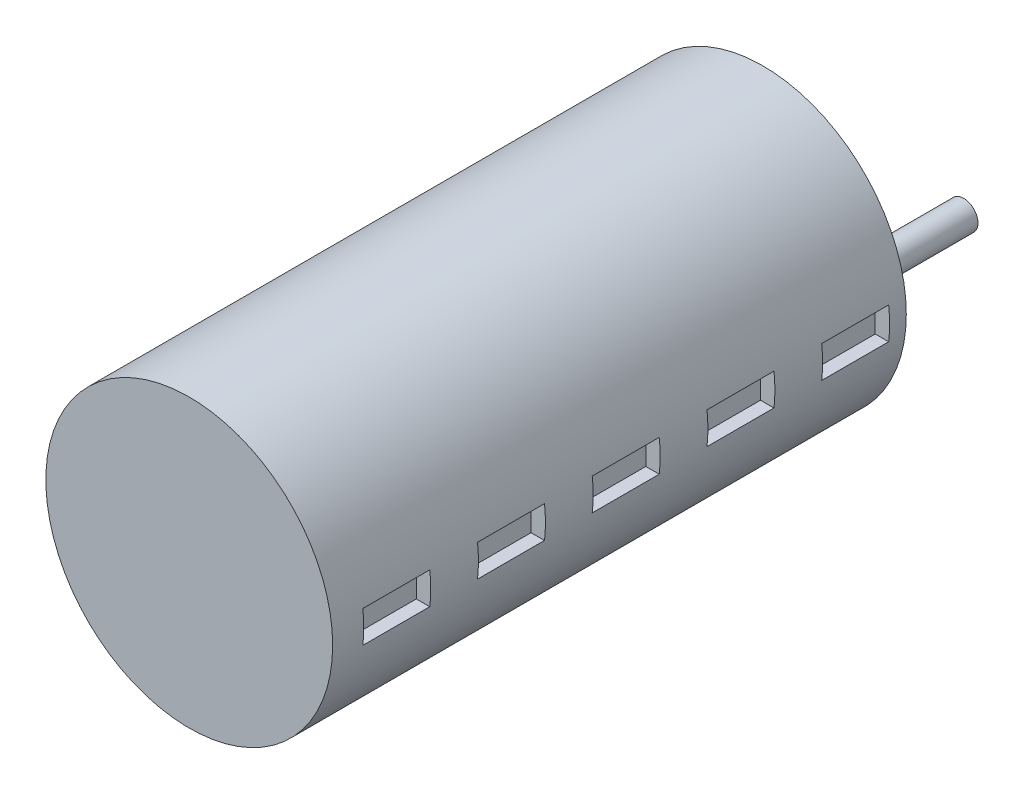
ISO-10303-21;
HEADER;
FILE_DESCRIPTION(('STEP AP214'),'2;1');
FILE_NAME('part.step','',(''),(''),'','','');
FILE_SCHEMA(('AUTOMOTIVE_DESIGN { 1 0 10303 214 1 1 1 1 }'));
ENDSEC;
DATA;
#1=APPLICATION_CONTEXT('core data for automotive mechanical design processes');
#2=APPLICATION_PROTOCOL_DEFINITION('international standard','automotive_design',2000,#1);
#3=PRODUCT_CONTEXT('',#1,'mechanical');
#4=PRODUCT('Part','Part','',(#3));
#5=PRODUCT_RELATED_PRODUCT_CATEGORY('part','',(#4));
#6=PRODUCT_DEFINITION_FORMATION('','',#4);
#7=PRODUCT_DEFINITION_CONTEXT('part definition',#1,'design');
#8=PRODUCT_DEFINITION('design','',#6,#7);
#9=PRODUCT_DEFINITION_SHAPE('','',#8);
#10=(LENGTH_UNIT() NAMED_UNIT(*) SI_UNIT(.MILLI.,.METRE.));
#11=(NAMED_UNIT(*) PLANE_ANGLE_UNIT() SI_UNIT($,.RADIAN.));
#12=(NAMED_UNIT(*) SI_UNIT($,.STERADIAN.) SOLID_ANGLE_UNIT());
#13=UNCERTAINTY_MEASURE_WITH_UNIT(LENGTH_MEASURE(1.E-05),#10,'distance_accuracy_value','');
#14=(GEOMETRIC_REPRESENTATION_CONTEXT(3) GLOBAL_UNCERTAINTY_ASSIGNED_CONTEXT((#13)) GLOBAL_UNIT_ASSIGNED_CONTEXT((#10,
#11,#12)) REPRESENTATION_CONTEXT('',''));
#15=CARTESIAN_POINT('',(0.,0.,0.));
#16=DIRECTION('',(0.,0.,1.));
#17=DIRECTION('',(1.,0.,0.));
#18=AXIS2_PLACEMENT_3D('',#15,#16,#17);
#19=CARTESIAN_POINT('',(0.,0.,0.));
#20=DIRECTION('',(0.,0.,1.));
#21=DIRECTION('',(1.,0.,0.));
#22=AXIS2_PLACEMENT_3D('',#19,#20,#21);
#23=PLANE('',#22);
#24=CARTESIAN_POINT('',(1.5,0.,0.));
#25=DIRECTION('',(0.,0.,1.));
#26=DIRECTION('',(1.,0.,0.));
#27=AXIS2_PLACEMENT_3D('',#24,#25,#26);
#28=CIRCLE('',#27,0.25);
#29=CARTESIAN_POINT('',(1.75,0.,0.));
#30=VERTEX_POINT('',#29);
#31=EDGE_CURVE('E309',#30,#30,#28,.F.);
#32=ORIENTED_EDGE('',*,*,#31,.F.);
#33=EDGE_LOOP('',(#32));
#34=FACE_BOUND('',#33,.T.);
#35=CARTESIAN_POINT('',(0.,0.,0.));
#36=DIRECTION('',(0.,0.,1.));
#37=DIRECTION('',(1.,0.,0.));
#38=AXIS2_PLACEMENT_3D('',#35,#36,#37);
#39=CIRCLE('',#38,2.5);
#40=CARTESIAN_POINT('',(2.5,0.,0.));
#41=VERTEX_POINT('',#40);
#42=EDGE_CURVE('E305',#41,#41,#39,.T.);
#43=ORIENTED_EDGE('',*,*,#42,.F.);
#44=EDGE_LOOP('',(#43));
#45=FACE_BOUND('',#44,.T.);
#46=CARTESIAN_POINT('',(-1.5,0.,0.));
#47=DIRECTION('',(0.,0.,1.));
#48=DIRECTION('',(1.,0.,0.));
#49=AXIS2_PLACEMENT_3D('',#46,#47,#48);
#50=CIRCLE('',#49,0.25);
#51=CARTESIAN_POINT('',(-1.25,0.,0.));
#52=VERTEX_POINT('',#51);
#53=EDGE_CURVE('E314',#52,#52,#50,.F.);
#54=ORIENTED_EDGE('',*,*,#53,.F.);
#55=EDGE_LOOP('',(#54));
#56=FACE_BOUND('',#55,.T.);
#57=ADVANCED_FACE('F35',(#34,#45,#56),#23,.F.);
#58=CARTESIAN_POINT('',(0.,0.,10.));
#59=DIRECTION('',(0.,0.,-1.));
#60=DIRECTION('',(-1.,0.,0.));
#61=AXIS2_PLACEMENT_3D('',#58,#59,#60);
#62=CYLINDRICAL_SURFACE('',#61,2.5);
#63=CARTESIAN_POINT('',(0.,0.,1.4594578679585));
#64=DIRECTION('',(0.,0.,1.));
#65=DIRECTION('',(1.,0.,0.));
#66=AXIS2_PLACEMENT_3D('',#63,#64,#65);
#67=CIRCLE('',#66,2.5);
#68=CARTESIAN_POINT('',(2.48446840544563,-0.278238642791499,1.4594578679585));
#69=VERTEX_POINT('',#68);
#70=CARTESIAN_POINT('',(2.48446840544563,0.278238642791499,1.4594578679585));
#71=VERTEX_POINT('',#70);
#72=EDGE_CURVE('E357',#69,#71,#67,.T.);
#73=ORIENTED_EDGE('',*,*,#72,.T.);
#74=DIRECTION('',(0.,0.,-1.));
#75=VECTOR('',#74,1.);
#76=CARTESIAN_POINT('',(2.48446840544563,0.278238642791499,10.));
#77=LINE('',#76,#75);
#78=CARTESIAN_POINT('',(2.48446840544563,0.278238642791499,0.291678363420454));
#79=VERTEX_POINT('',#78);
#80=EDGE_CURVE('E11',#71,#79,#77,.T.);
#81=ORIENTED_EDGE('',*,*,#80,.T.);
#82=CARTESIAN_POINT('',(0.,0.,0.291678363420454));
#83=DIRECTION('',(0.,0.,-1.));
#84=DIRECTION('',(-1.,0.,0.));
#85=AXIS2_PLACEMENT_3D('',#82,#83,#84);
#86=CIRCLE('',#85,2.5);
#87=CARTESIAN_POINT('',(2.48446840544563,-0.278238642791499,0.291678363420454));
#88=VERTEX_POINT('',#87);
#89=EDGE_CURVE('E43',#79,#88,#86,.T.);
#90=ORIENTED_EDGE('',*,*,#89,.T.);
#91=DIRECTION('',(0.,0.,-1.));
#92=VECTOR('',#91,1.);
#93=CARTESIAN_POINT('',(2.48446840544563,-0.278238642791499,10.));
#94=LINE('',#93,#92);
#95=EDGE_CURVE('E359',#88,#69,#94,.F.);
#96=ORIENTED_EDGE('',*,*,#95,.T.);
#97=EDGE_LOOP('',(#73,#81,#90,#96));
#98=FACE_BOUND('',#97,.T.);
#99=CARTESIAN_POINT('',(0.,0.,3.4594578679585));
#100=DIRECTION('',(0.,0.,1.));
#101=DIRECTION('',(1.,0.,0.));
#102=AXIS2_PLACEMENT_3D('',#99,#100,#101);
#103=CIRCLE('',#102,2.5);
#104=CARTESIAN_POINT('',(2.48446840544563,-0.278238642791499,3.4594578679585));
#105=VERTEX_POINT('',#104);
#106=CARTESIAN_POINT('',(2.48446840544563,0.278238642791499,3.4594578679585));
#107=VERTEX_POINT('',#106);
#108=EDGE_CURVE('E346',#105,#107,#103,.T.);
#109=ORIENTED_EDGE('',*,*,#108,.T.);
#110=DIRECTION('',(0.,0.,-1.));
#111=VECTOR('',#110,1.);
#112=CARTESIAN_POINT('',(2.48446840544563,0.278238642791499,10.));
#113=LINE('',#112,#111);
#114=CARTESIAN_POINT('',(2.48446840544563,0.278238642791499,2.29167836342045));
#115=VERTEX_POINT('',#114);
#116=EDGE_CURVE('E354',#107,#115,#113,.T.);
#117=ORIENTED_EDGE('',*,*,#116,.T.);
#118=CARTESIAN_POINT('',(0.,0.,2.29167836342045));
#119=DIRECTION('',(0.,0.,-1.));
#120=DIRECTION('',(-1.,0.,0.));
#121=AXIS2_PLACEMENT_3D('',#118,#119,#120);
#122=CIRCLE('',#121,2.5);
#123=CARTESIAN_POINT('',(2.48446840544563,-0.278238642791499,2.29167836342045));
#124=VERTEX_POINT('',#123);
#125=EDGE_CURVE('E351',#115,#124,#122,.T.);
#126=ORIENTED_EDGE('',*,*,#125,.T.);
#127=DIRECTION('',(0.,0.,-1.));
#128=VECTOR('',#127,1.);
#129=CARTESIAN_POINT('',(2.48446840544563,-0.278238642791499,10.));
#130=LINE('',#129,#128);
#131=EDGE_CURVE('E348',#124,#105,#130,.F.);
#132=ORIENTED_EDGE('',*,*,#131,.T.);
#133=EDGE_LOOP('',(#109,#117,#126,#132));
#134=FACE_BOUND('',#133,.T.);
#135=CARTESIAN_POINT('',(0.,0.,5.4594578679585));
#136=DIRECTION('',(0.,0.,1.));
#137=DIRECTION('',(1.,0.,0.));
#138=AXIS2_PLACEMENT_3D('',#135,#136,#137);
#139=CIRCLE('',#138,2.5);
#140=CARTESIAN_POINT('',(2.48446840544563,-0.278238642791499,5.4594578679585));
#141=VERTEX_POINT('',#140);
#142=CARTESIAN_POINT('',(2.48446840544563,0.278238642791499,5.4594578679585));
#143=VERTEX_POINT('',#142);
#144=EDGE_CURVE('E335',#141,#143,#139,.T.);
#145=ORIENTED_EDGE('',*,*,#144,.T.);
#146=DIRECTION('',(0.,0.,-1.));
#147=VECTOR('',#146,1.);
#148=CARTESIAN_POINT('',(2.48446840544563,0.278238642791499,10.));
#149=LINE('',#148,#147);
#150=CARTESIAN_POINT('',(2.48446840544563,0.278238642791499,4.29167836342045));
#151=VERTEX_POINT('',#150);
#152=EDGE_CURVE('E343',#143,#151,#149,.T.);
#153=ORIENTED_EDGE('',*,*,#152,.T.);
#154=CARTESIAN_POINT('',(0.,0.,4.29167836342045));
#155=DIRECTION('',(0.,0.,-1.));
#156=DIRECTION('',(-1.,0.,0.));
#157=AXIS2_PLACEMENT_3D('',#154,#155,#156);
#158=CIRCLE('',#157,2.5);
#159=CARTESIAN_POINT('',(2.48446840544563,-0.278238642791499,4.29167836342045));
#160=VERTEX_POINT('',#159);
#161=EDGE_CURVE('E340',#151,#160,#158,.T.);
#162=ORIENTED_EDGE('',*,*,#161,.T.);
#163=DIRECTION('',(0.,0.,-1.));
#164=VECTOR('',#163,1.);
#165=CARTESIAN_POINT('',(2.48446840544563,-0.278238642791499,10.));
#166=LINE('',#165,#164);
#167=EDGE_CURVE('E337',#160,#141,#166,.F.);
#168=ORIENTED_EDGE('',*,*,#167,.T.);
#169=EDGE_LOOP('',(#145,#153,#162,#168));
#170=FACE_BOUND('',#169,.T.);
#171=CARTESIAN_POINT('',(0.,0.,7.4594578679585));
#172=DIRECTION('',(0.,0.,1.));
#173=DIRECTION('',(1.,0.,0.));
#174=AXIS2_PLACEMENT_3D('',#171,#172,#173);
#175=CIRCLE('',#174,2.5);
#176=CARTESIAN_POINT('',(2.48446840544563,-0.278238642791499,7.4594578679585));
#177=VERTEX_POINT('',#176);
#178=CARTESIAN_POINT('',(2.48446840544563,0.278238642791499,7.4594578679585));
#179=VERTEX_POINT('',#178);
#180=EDGE_CURVE('E324',#177,#179,#175,.T.);
#181=ORIENTED_EDGE('',*,*,#180,.T.);
#182=DIRECTION('',(0.,0.,-1.));
#183=VECTOR('',#182,1.);
#184=CARTESIAN_POINT('',(2.48446840544563,0.278238642791499,10.));
#185=LINE('',#184,#183);
#186=CARTESIAN_POINT('',(2.48446840544563,0.278238642791499,6.29167836342045));
#187=VERTEX_POINT('',#186);
#188=EDGE_CURVE('E332',#179,#187,#185,.T.);
#189=ORIENTED_EDGE('',*,*,#188,.T.);
#190=CARTESIAN_POINT('',(0.,0.,6.29167836342045));
#191=DIRECTION('',(0.,0.,-1.));
#192=DIRECTION('',(-1.,0.,0.));
#193=AXIS2_PLACEMENT_3D('',#190,#191,#192);
#194=CIRCLE('',#193,2.5);
#195=CARTESIAN_POINT('',(2.48446840544563,-0.278238642791499,6.29167836342045));
#196=VERTEX_POINT('',#195);
#197=EDGE_CURVE('E329',#187,#196,#194,.T.);
#198=ORIENTED_EDGE('',*,*,#197,.T.);
#199=DIRECTION('',(0.,0.,-1.));
#200=VECTOR('',#199,1.);
#201=CARTESIAN_POINT('',(2.48446840544563,-0.278238642791499,10.));
#202=LINE('',#201,#200);
#203=EDGE_CURVE('E326',#196,#177,#202,.F.);
#204=ORIENTED_EDGE('',*,*,#203,.T.);
#205=EDGE_LOOP('',(#181,#189,#198,#204));
#206=FACE_BOUND('',#205,.T.);
#207=CARTESIAN_POINT('',(0.,0.,9.4594578679585));
#208=DIRECTION('',(0.,0.,1.));
#209=DIRECTION('',(1.,0.,0.));
#210=AXIS2_PLACEMENT_3D('',#207,#208,#209);
#211=CIRCLE('',#210,2.5);
#212=CARTESIAN_POINT('',(2.48446840544563,-0.278238642791499,9.4594578679585));
#213=VERTEX_POINT('',#212);
#214=CARTESIAN_POINT('',(2.48446840544563,0.278238642791499,9.4594578679585));
#215=VERTEX_POINT('',#214);
#216=EDGE_CURVE('E317',#213,#215,#211,.T.);
#217=ORIENTED_EDGE('',*,*,#216,.T.);
#218=DIRECTION('',(0.,0.,-1.));
#219=VECTOR('',#218,1.);
#220=CARTESIAN_POINT('',(2.48446840544563,0.278238642791499,10.));
#221=LINE('',#220,#219);
#222=CARTESIAN_POINT('',(2.48446840544563,0.278238642791499,8.29167836342045));
#223=VERTEX_POINT('',#222);
#224=EDGE_CURVE('E321',#215,#223,#221,.T.);
#225=ORIENTED_EDGE('',*,*,#224,.T.);
#226=CARTESIAN_POINT('',(0.,0.,8.29167836342045));
#227=DIRECTION('',(0.,0.,-1.));
#228=DIRECTION('',(-1.,0.,0.));
#229=AXIS2_PLACEMENT_3D('',#226,#227,#228);
#230=CIRCLE('',#229,2.5);
#231=CARTESIAN_POINT('',(2.48446840544563,-0.278238642791499,8.29167836342045));
#232=VERTEX_POINT('',#231);
#233=EDGE_CURVE('E50',#223,#232,#230,.T.);
#234=ORIENTED_EDGE('',*,*,#233,.T.);
#235=DIRECTION('',(0.,0.,-1.));
#236=VECTOR('',#235,1.);
#237=CARTESIAN_POINT('',(2.48446840544563,-0.278238642791499,10.));
#238=LINE('',#237,#236);
#239=EDGE_CURVE('E58',#232,#213,#238,.F.);
#240=ORIENTED_EDGE('',*,*,#239,.T.);
#241=EDGE_LOOP('',(#217,#225,#234,#240));
#242=FACE_BOUND('',#241,.T.);
#243=CARTESIAN_POINT('',(0.,0.,10.));
#244=DIRECTION('',(0.,0.,1.));
#245=DIRECTION('',(1.,0.,0.));
#246=AXIS2_PLACEMENT_3D('',#243,#244,#245);
#247=CIRCLE('',#246,2.5);
#248=CARTESIAN_POINT('',(2.5,0.,10.));
#249=VERTEX_POINT('',#248);
#250=EDGE_CURVE('E306',#249,#249,#247,.T.);
#251=ORIENTED_EDGE('',*,*,#250,.F.);
#252=EDGE_LOOP('',(#251));
#253=FACE_BOUND('',#252,.T.);
#254=ORIENTED_EDGE('',*,*,#42,.T.);
#255=EDGE_LOOP('',(#254));
#256=FACE_BOUND('',#255,.T.);
#257=ADVANCED_FACE('F37',(#98,#134,#170,#206,#242,#253,#256),#62,.T.);
#258=CARTESIAN_POINT('',(0.,0.,10.));
#259=DIRECTION('',(0.,0.,1.));
#260=DIRECTION('',(1.,0.,0.));
#261=AXIS2_PLACEMENT_3D('',#258,#259,#260);
#262=PLANE('',#261);
#263=ORIENTED_EDGE('',*,*,#250,.T.);
#264=EDGE_LOOP('',(#263));
#265=FACE_BOUND('',#264,.T.);
#266=ADVANCED_FACE('F381',(#265),#262,.T.);
#267=CARTESIAN_POINT('',(1.5,0.,-2.));
#268=DIRECTION('',(0.,0.,1.));
#269=DIRECTION('',(1.,0.,0.));
#270=AXIS2_PLACEMENT_3D('',#267,#268,#269);
#271=CYLINDRICAL_SURFACE('',#270,0.25);
#272=CARTESIAN_POINT('',(1.5,0.,-2.));
#273=DIRECTION('',(0.,0.,-1.));
#274=DIRECTION('',(-1.,0.,0.));
#275=AXIS2_PLACEMENT_3D('',#272,#273,#274);
#276=CIRCLE('',#275,0.25);
#277=CARTESIAN_POINT('',(1.25,0.,-2.));
#278=VERTEX_POINT('',#277);
#279=EDGE_CURVE('E302',#278,#278,#276,.T.);
#280=ORIENTED_EDGE('',*,*,#279,.F.);
#281=EDGE_LOOP('',(#280));
#282=FACE_BOUND('',#281,.T.);
#283=ORIENTED_EDGE('',*,*,#31,.T.);
#284=EDGE_LOOP('',(#283));
#285=FACE_BOUND('',#284,.T.);
#286=ADVANCED_FACE('F387',(#282,#285),#271,.T.);
#287=CARTESIAN_POINT('',(1.5,0.,-2.));
#288=DIRECTION('',(0.,0.,-1.));
#289=DIRECTION('',(-1.,0.,0.));
#290=AXIS2_PLACEMENT_3D('',#287,#288,#289);
#291=PLANE('',#290);
#292=ORIENTED_EDGE('',*,*,#279,.T.);
#293=EDGE_LOOP('',(#292));
#294=FACE_BOUND('',#293,.T.);
#295=ADVANCED_FACE('F391',(#294),#291,.T.);
#296=CARTESIAN_POINT('',(-1.5,0.,-2.));
#297=DIRECTION('',(0.,0.,1.));
#298=DIRECTION('',(1.,0.,0.));
#299=AXIS2_PLACEMENT_3D('',#296,#297,#298);
#300=CYLINDRICAL_SURFACE('',#299,0.25);
#301=CARTESIAN_POINT('',(-1.5,0.,-2.));
#302=DIRECTION('',(0.,0.,-1.));
#303=DIRECTION('',(1.,0.,0.));
#304=AXIS2_PLACEMENT_3D('',#301,#302,#303);
#305=CIRCLE('',#304,0.25);
#306=CARTESIAN_POINT('',(-1.25,0.,-2.));
#307=VERTEX_POINT('',#306);
#308=EDGE_CURVE('E293',#307,#307,#305,.T.);
#309=ORIENTED_EDGE('',*,*,#308,.F.);
#310=EDGE_LOOP('',(#309));
#311=FACE_BOUND('',#310,.T.);
#312=ORIENTED_EDGE('',*,*,#53,.T.);
#313=EDGE_LOOP('',(#312));
#314=FACE_BOUND('',#313,.T.);
#315=ADVANCED_FACE('F395',(#311,#314),#300,.T.);
#316=CARTESIAN_POINT('',(-1.5,0.,-2.));
#317=DIRECTION('',(0.,0.,1.));
#318=DIRECTION('',(1.,0.,0.));
#319=AXIS2_PLACEMENT_3D('',#316,#317,#318);
#320=PLANE('',#319);
#321=ORIENTED_EDGE('',*,*,#308,.T.);
#322=EDGE_LOOP('',(#321));
#323=FACE_BOUND('',#322,.T.);
#324=ADVANCED_FACE('F399',(#323),#320,.F.);
#325=CARTESIAN_POINT('',(2.25,0.278238642791499,9.4594578679585));
#326=DIRECTION('',(0.,1.,0.));
#327=DIRECTION('',(0.,0.,1.));
#328=AXIS2_PLACEMENT_3D('',#325,#326,#327);
#329=PLANE('',#328);
#330=DIRECTION('',(1.,0.,0.));
#331=VECTOR('',#330,1.);
#332=CARTESIAN_POINT('',(2.25,0.278238642791499,9.4594578679585));
#333=LINE('',#332,#331);
#334=CARTESIAN_POINT('',(2.25,0.278238642791499,9.4594578679585));
#335=VERTEX_POINT('',#334);
#336=EDGE_CURVE('E290',#335,#215,#333,.T.);
#337=ORIENTED_EDGE('',*,*,#336,.F.);
#338=DIRECTION('',(0.,0.,1.));
#339=VECTOR('',#338,1.);
#340=CARTESIAN_POINT('',(2.25,0.278238642791499,9.4594578679585));
#341=LINE('',#340,#339);
#342=CARTESIAN_POINT('',(2.25,0.278238642791499,8.29167836342045));
#343=VERTEX_POINT('',#342);
#344=EDGE_CURVE('E270',#343,#335,#341,.T.);
#345=ORIENTED_EDGE('',*,*,#344,.F.);
#346=DIRECTION('',(1.,0.,0.));
#347=VECTOR('',#346,1.);
#348=CARTESIAN_POINT('',(2.25,0.278238642791499,8.29167836342045));
#349=LINE('',#348,#347);
#350=EDGE_CURVE('E291',#343,#223,#349,.T.);
#351=ORIENTED_EDGE('',*,*,#350,.T.);
#352=ORIENTED_EDGE('',*,*,#224,.F.);
#353=EDGE_LOOP('',(#337,#345,#351,#352));
#354=FACE_BOUND('',#353,.T.);
#355=ADVANCED_FACE('F403',(#354),#329,.F.);
#356=CARTESIAN_POINT('',(2.25,0.278238642791499,8.29167836342045));
#357=DIRECTION('',(0.,0.,-1.));
#358=DIRECTION('',(-1.,0.,0.));
#359=AXIS2_PLACEMENT_3D('',#356,#357,#358);
#360=PLANE('',#359);
#361=ORIENTED_EDGE('',*,*,#350,.F.);
#362=DIRECTION('',(0.,1.,0.));
#363=VECTOR('',#362,1.);
#364=CARTESIAN_POINT('',(2.25,0.278238642791499,8.29167836342045));
#365=LINE('',#364,#363);
#366=CARTESIAN_POINT('',(2.25,-0.278238642791499,8.29167836342045));
#367=VERTEX_POINT('',#366);
#368=EDGE_CURVE('E287',#367,#343,#365,.T.);
#369=ORIENTED_EDGE('',*,*,#368,.F.);
#370=DIRECTION('',(1.,0.,0.));
#371=VECTOR('',#370,1.);
#372=CARTESIAN_POINT('',(2.25,-0.278238642791499,8.29167836342045));
#373=LINE('',#372,#371);
#374=EDGE_CURVE('E294',#367,#232,#373,.T.);
#375=ORIENTED_EDGE('',*,*,#374,.T.);
#376=ORIENTED_EDGE('',*,*,#233,.F.);
#377=EDGE_LOOP('',(#361,#369,#375,#376));
#378=FACE_BOUND('',#377,.T.);
#379=ADVANCED_FACE('F407',(#378),#360,.F.);
#380=CARTESIAN_POINT('',(2.25,-0.278238642791499,9.4594578679585));
#381=DIRECTION('',(0.,-1.,0.));
#382=DIRECTION('',(0.,0.,-1.));
#383=AXIS2_PLACEMENT_3D('',#380,#381,#382);
#384=PLANE('',#383);
#385=ORIENTED_EDGE('',*,*,#374,.F.);
#386=DIRECTION('',(0.,0.,-1.));
#387=VECTOR('',#386,1.);
#388=CARTESIAN_POINT('',(2.25,-0.278238642791499,9.4594578679585));
#389=LINE('',#388,#387);
#390=CARTESIAN_POINT('',(2.25,-0.278238642791499,9.4594578679585));
#391=VERTEX_POINT('',#390);
#392=EDGE_CURVE('E284',#391,#367,#389,.T.);
#393=ORIENTED_EDGE('',*,*,#392,.F.);
#394=DIRECTION('',(1.,0.,0.));
#395=VECTOR('',#394,1.);
#396=CARTESIAN_POINT('',(2.25,-0.278238642791499,9.4594578679585));
#397=LINE('',#396,#395);
#398=EDGE_CURVE('E296',#391,#213,#397,.T.);
#399=ORIENTED_EDGE('',*,*,#398,.T.);
#400=ORIENTED_EDGE('',*,*,#239,.F.);
#401=EDGE_LOOP('',(#385,#393,#399,#400));
#402=FACE_BOUND('',#401,.T.);
#403=ADVANCED_FACE('F413',(#402),#384,.F.);
#404=CARTESIAN_POINT('',(2.25,0.278238642791499,9.4594578679585));
#405=DIRECTION('',(0.,0.,1.));
#406=DIRECTION('',(1.,0.,0.));
#407=AXIS2_PLACEMENT_3D('',#404,#405,#406);
#408=PLANE('',#407);
#409=ORIENTED_EDGE('',*,*,#216,.F.);
#410=ORIENTED_EDGE('',*,*,#398,.F.);
#411=DIRECTION('',(0.,-1.,0.));
#412=VECTOR('',#411,1.);
#413=CARTESIAN_POINT('',(2.25,0.278238642791499,9.4594578679585));
#414=LINE('',#413,#412);
#415=EDGE_CURVE('E281',#335,#391,#414,.T.);
#416=ORIENTED_EDGE('',*,*,#415,.F.);
#417=ORIENTED_EDGE('',*,*,#336,.T.);
#418=EDGE_LOOP('',(#409,#410,#416,#417));
#419=FACE_BOUND('',#418,.T.);
#420=ADVANCED_FACE('F409',(#419),#408,.F.);
#421=CARTESIAN_POINT('',(2.25,0.278238642791499,8.29167836342045));
#422=DIRECTION('',(-1.,0.,0.));
#423=DIRECTION('',(0.,0.,1.));
#424=AXIS2_PLACEMENT_3D('',#421,#422,#423);
#425=PLANE('',#424);
#426=ORIENTED_EDGE('',*,*,#344,.T.);
#427=ORIENTED_EDGE('',*,*,#415,.T.);
#428=ORIENTED_EDGE('',*,*,#392,.T.);
#429=ORIENTED_EDGE('',*,*,#368,.T.);
#430=EDGE_LOOP('',(#426,#427,#428,#429));
#431=FACE_BOUND('',#430,.T.);
#432=ADVANCED_FACE('F412',(#431),#425,.F.);
#433=CARTESIAN_POINT('',(2.25,0.278238642791499,7.4594578679585));
#434=DIRECTION('',(0.,1.,0.));
#435=DIRECTION('',(0.,0.,1.));
#436=AXIS2_PLACEMENT_3D('',#433,#434,#435);
#437=PLANE('',#436);
#438=DIRECTION('',(1.,0.,0.));
#439=VECTOR('',#438,1.);
#440=CARTESIAN_POINT('',(2.25,0.278238642791499,7.4594578679585));
#441=LINE('',#440,#439);
#442=CARTESIAN_POINT('',(2.25,0.278238642791499,7.4594578679585));
#443=VERTEX_POINT('',#442);
#444=EDGE_CURVE('E266',#443,#179,#441,.T.);
#445=ORIENTED_EDGE('',*,*,#444,.F.);
#446=DIRECTION('',(0.,0.,1.));
#447=VECTOR('',#446,1.);
#448=CARTESIAN_POINT('',(2.25,0.278238642791499,7.4594578679585));
#449=LINE('',#448,#447);
#450=CARTESIAN_POINT('',(2.25,0.278238642791499,6.29167836342045));
#451=VERTEX_POINT('',#450);
#452=EDGE_CURVE('E246',#451,#443,#449,.T.);
#453=ORIENTED_EDGE('',*,*,#452,.F.);
#454=DIRECTION('',(1.,0.,0.));
#455=VECTOR('',#454,1.);
#456=CARTESIAN_POINT('',(2.25,0.278238642791499,6.29167836342045));
#457=LINE('',#456,#455);
#458=EDGE_CURVE('E267',#451,#187,#457,.T.);
#459=ORIENTED_EDGE('',*,*,#458,.T.);
#460=ORIENTED_EDGE('',*,*,#188,.F.);
#461=EDGE_LOOP('',(#445,#453,#459,#460));
#462=FACE_BOUND('',#461,.T.);
#463=ADVANCED_FACE('F421',(#462),#437,.F.);
#464=CARTESIAN_POINT('',(2.25,0.278238642791499,6.29167836342045));
#465=DIRECTION('',(0.,0.,-1.));
#466=DIRECTION('',(-1.,0.,0.));
#467=AXIS2_PLACEMENT_3D('',#464,#465,#466);
#468=PLANE('',#467);
#469=ORIENTED_EDGE('',*,*,#458,.F.);
#470=DIRECTION('',(0.,1.,0.));
#471=VECTOR('',#470,1.);
#472=CARTESIAN_POINT('',(2.25,0.278238642791499,6.29167836342045));
#473=LINE('',#472,#471);
#474=CARTESIAN_POINT('',(2.25,-0.278238642791499,6.29167836342045));
#475=VERTEX_POINT('',#474);
#476=EDGE_CURVE('E263',#475,#451,#473,.T.);
#477=ORIENTED_EDGE('',*,*,#476,.F.);
#478=DIRECTION('',(1.,0.,0.));
#479=VECTOR('',#478,1.);
#480=CARTESIAN_POINT('',(2.25,-0.278238642791499,6.29167836342045));
#481=LINE('',#480,#479);
#482=EDGE_CURVE('E271',#475,#196,#481,.T.);
#483=ORIENTED_EDGE('',*,*,#482,.T.);
#484=ORIENTED_EDGE('',*,*,#197,.F.);
#485=EDGE_LOOP('',(#469,#477,#483,#484));
#486=FACE_BOUND('',#485,.T.);
#487=ADVANCED_FACE('F425',(#486),#468,.F.);
#488=CARTESIAN_POINT('',(2.25,-0.278238642791499,7.4594578679585));
#489=DIRECTION('',(0.,-1.,0.));
#490=DIRECTION('',(0.,0.,-1.));
#491=AXIS2_PLACEMENT_3D('',#488,#489,#490);
#492=PLANE('',#491);
#493=ORIENTED_EDGE('',*,*,#482,.F.);
#494=DIRECTION('',(0.,0.,-1.));
#495=VECTOR('',#494,1.);
#496=CARTESIAN_POINT('',(2.25,-0.278238642791499,7.4594578679585));
#497=LINE('',#496,#495);
#498=CARTESIAN_POINT('',(2.25,-0.278238642791499,7.4594578679585));
#499=VERTEX_POINT('',#498);
#500=EDGE_CURVE('E260',#499,#475,#497,.T.);
#501=ORIENTED_EDGE('',*,*,#500,.F.);
#502=DIRECTION('',(1.,0.,0.));
#503=VECTOR('',#502,1.);
#504=CARTESIAN_POINT('',(2.25,-0.278238642791499,7.4594578679585));
#505=LINE('',#504,#503);
#506=EDGE_CURVE('E274',#499,#177,#505,.T.);
#507=ORIENTED_EDGE('',*,*,#506,.T.);
#508=ORIENTED_EDGE('',*,*,#203,.F.);
#509=EDGE_LOOP('',(#493,#501,#507,#508));
#510=FACE_BOUND('',#509,.T.);
#511=ADVANCED_FACE('F431',(#510),#492,.F.);
#512=CARTESIAN_POINT('',(2.25,0.278238642791499,7.4594578679585));
#513=DIRECTION('',(0.,0.,1.));
#514=DIRECTION('',(1.,0.,0.));
#515=AXIS2_PLACEMENT_3D('',#512,#513,#514);
#516=PLANE('',#515);
#517=ORIENTED_EDGE('',*,*,#180,.F.);
#518=ORIENTED_EDGE('',*,*,#506,.F.);
#519=DIRECTION('',(0.,-1.,0.));
#520=VECTOR('',#519,1.);
#521=CARTESIAN_POINT('',(2.25,0.278238642791499,7.4594578679585));
#522=LINE('',#521,#520);
#523=EDGE_CURVE('E257',#443,#499,#522,.T.);
#524=ORIENTED_EDGE('',*,*,#523,.F.);
#525=ORIENTED_EDGE('',*,*,#444,.T.);
#526=EDGE_LOOP('',(#517,#518,#524,#525));
#527=FACE_BOUND('',#526,.T.);
#528=ADVANCED_FACE('F427',(#527),#516,.F.);
#529=CARTESIAN_POINT('',(2.25,0.278238642791499,6.29167836342045));
#530=DIRECTION('',(-1.,0.,0.));
#531=DIRECTION('',(0.,0.,1.));
#532=AXIS2_PLACEMENT_3D('',#529,#530,#531);
#533=PLANE('',#532);
#534=ORIENTED_EDGE('',*,*,#452,.T.);
#535=ORIENTED_EDGE('',*,*,#523,.T.);
#536=ORIENTED_EDGE('',*,*,#500,.T.);
#537=ORIENTED_EDGE('',*,*,#476,.T.);
#538=EDGE_LOOP('',(#534,#535,#536,#537));
#539=FACE_BOUND('',#538,.T.);
#540=ADVANCED_FACE('F430',(#539),#533,.F.);
#541=CARTESIAN_POINT('',(2.25,0.278238642791499,5.4594578679585));
#542=DIRECTION('',(0.,1.,0.));
#543=DIRECTION('',(0.,0.,1.));
#544=AXIS2_PLACEMENT_3D('',#541,#542,#543);
#545=PLANE('',#544);
#546=DIRECTION('',(1.,0.,0.));
#547=VECTOR('',#546,1.);
#548=CARTESIAN_POINT('',(2.25,0.278238642791499,5.4594578679585));
#549=LINE('',#548,#547);
#550=CARTESIAN_POINT('',(2.25,0.278238642791499,5.4594578679585));
#551=VERTEX_POINT('',#550);
#552=EDGE_CURVE('E242',#551,#143,#549,.T.);
#553=ORIENTED_EDGE('',*,*,#552,.F.);
#554=DIRECTION('',(0.,0.,1.));
#555=VECTOR('',#554,1.);
#556=CARTESIAN_POINT('',(2.25,0.278238642791499,5.4594578679585));
#557=LINE('',#556,#555);
#558=CARTESIAN_POINT('',(2.25,0.278238642791499,4.29167836342045));
#559=VERTEX_POINT('',#558);
#560=EDGE_CURVE('E222',#559,#551,#557,.T.);
#561=ORIENTED_EDGE('',*,*,#560,.F.);
#562=DIRECTION('',(1.,0.,0.));
#563=VECTOR('',#562,1.);
#564=CARTESIAN_POINT('',(2.25,0.278238642791499,4.29167836342045));
#565=LINE('',#564,#563);
#566=EDGE_CURVE('E243',#559,#151,#565,.T.);
#567=ORIENTED_EDGE('',*,*,#566,.T.);
#568=ORIENTED_EDGE('',*,*,#152,.F.);
#569=EDGE_LOOP('',(#553,#561,#567,#568));
#570=FACE_BOUND('',#569,.T.);
#571=ADVANCED_FACE('F441',(#570),#545,.F.);
#572=CARTESIAN_POINT('',(2.25,0.278238642791499,4.29167836342045));
#573=DIRECTION('',(0.,0.,-1.));
#574=DIRECTION('',(-1.,0.,0.));
#575=AXIS2_PLACEMENT_3D('',#572,#573,#574);
#576=PLANE('',#575);
#577=ORIENTED_EDGE('',*,*,#566,.F.);
#578=DIRECTION('',(0.,1.,0.));
#579=VECTOR('',#578,1.);
#580=CARTESIAN_POINT('',(2.25,0.278238642791499,4.29167836342045));
#581=LINE('',#580,#579);
#582=CARTESIAN_POINT('',(2.25,-0.278238642791499,4.29167836342045));
#583=VERTEX_POINT('',#582);
#584=EDGE_CURVE('E239',#583,#559,#581,.T.);
#585=ORIENTED_EDGE('',*,*,#584,.F.);
#586=DIRECTION('',(1.,0.,0.));
#587=VECTOR('',#586,1.);
#588=CARTESIAN_POINT('',(2.25,-0.278238642791499,4.29167836342045));
#589=LINE('',#588,#587);
#590=EDGE_CURVE('E247',#583,#160,#589,.T.);
#591=ORIENTED_EDGE('',*,*,#590,.T.);
#592=ORIENTED_EDGE('',*,*,#161,.F.);
#593=EDGE_LOOP('',(#577,#585,#591,#592));
#594=FACE_BOUND('',#593,.T.);
#595=ADVANCED_FACE('F445',(#594),#576,.F.);
#596=CARTESIAN_POINT('',(2.25,-0.278238642791499,5.4594578679585));
#597=DIRECTION('',(0.,-1.,0.));
#598=DIRECTION('',(0.,0.,-1.));
#599=AXIS2_PLACEMENT_3D('',#596,#597,#598);
#600=PLANE('',#599);
#601=ORIENTED_EDGE('',*,*,#590,.F.);
#602=DIRECTION('',(0.,0.,-1.));
#603=VECTOR('',#602,1.);
#604=CARTESIAN_POINT('',(2.25,-0.278238642791499,5.4594578679585));
#605=LINE('',#604,#603);
#606=CARTESIAN_POINT('',(2.25,-0.278238642791499,5.4594578679585));
#607=VERTEX_POINT('',#606);
#608=EDGE_CURVE('E236',#607,#583,#605,.T.);
#609=ORIENTED_EDGE('',*,*,#608,.F.);
#610=DIRECTION('',(1.,0.,0.));
#611=VECTOR('',#610,1.);
#612=CARTESIAN_POINT('',(2.25,-0.278238642791499,5.4594578679585));
#613=LINE('',#612,#611);
#614=EDGE_CURVE('E250',#607,#141,#613,.T.);
#615=ORIENTED_EDGE('',*,*,#614,.T.);
#616=ORIENTED_EDGE('',*,*,#167,.F.);
#617=EDGE_LOOP('',(#601,#609,#615,#616));
#618=FACE_BOUND('',#617,.T.);
#619=ADVANCED_FACE('F451',(#618),#600,.F.);
#620=CARTESIAN_POINT('',(2.25,0.278238642791499,5.4594578679585));
#621=DIRECTION('',(0.,0.,1.));
#622=DIRECTION('',(1.,0.,0.));
#623=AXIS2_PLACEMENT_3D('',#620,#621,#622);
#624=PLANE('',#623);
#625=ORIENTED_EDGE('',*,*,#144,.F.);
#626=ORIENTED_EDGE('',*,*,#614,.F.);
#627=DIRECTION('',(0.,-1.,0.));
#628=VECTOR('',#627,1.);
#629=CARTESIAN_POINT('',(2.25,0.278238642791499,5.4594578679585));
#630=LINE('',#629,#628);
#631=EDGE_CURVE('E233',#551,#607,#630,.T.);
#632=ORIENTED_EDGE('',*,*,#631,.F.);
#633=ORIENTED_EDGE('',*,*,#552,.T.);
#634=EDGE_LOOP('',(#625,#626,#632,#633));
#635=FACE_BOUND('',#634,.T.);
#636=ADVANCED_FACE('F447',(#635),#624,.F.);
#637=CARTESIAN_POINT('',(2.25,0.278238642791499,4.29167836342045));
#638=DIRECTION('',(-1.,0.,0.));
#639=DIRECTION('',(0.,0.,1.));
#640=AXIS2_PLACEMENT_3D('',#637,#638,#639);
#641=PLANE('',#640);
#642=ORIENTED_EDGE('',*,*,#560,.T.);
#643=ORIENTED_EDGE('',*,*,#631,.T.);
#644=ORIENTED_EDGE('',*,*,#608,.T.);
#645=ORIENTED_EDGE('',*,*,#584,.T.);
#646=EDGE_LOOP('',(#642,#643,#644,#645));
#647=FACE_BOUND('',#646,.T.);
#648=ADVANCED_FACE('F450',(#647),#641,.F.);
#649=CARTESIAN_POINT('',(2.25,0.278238642791499,3.4594578679585));
#650=DIRECTION('',(0.,1.,0.));
#651=DIRECTION('',(0.,0.,1.));
#652=AXIS2_PLACEMENT_3D('',#649,#650,#651);
#653=PLANE('',#652);
#654=DIRECTION('',(1.,0.,0.));
#655=VECTOR('',#654,1.);
#656=CARTESIAN_POINT('',(2.25,0.278238642791499,3.4594578679585));
#657=LINE('',#656,#655);
#658=CARTESIAN_POINT('',(2.25,0.278238642791499,3.4594578679585));
#659=VERTEX_POINT('',#658);
#660=EDGE_CURVE('E218',#659,#107,#657,.T.);
#661=ORIENTED_EDGE('',*,*,#660,.F.);
#662=DIRECTION('',(0.,0.,1.));
#663=VECTOR('',#662,1.);
#664=CARTESIAN_POINT('',(2.25,0.278238642791499,3.4594578679585));
#665=LINE('',#664,#663);
#666=CARTESIAN_POINT('',(2.25,0.278238642791499,2.29167836342045));
#667=VERTEX_POINT('',#666);
#668=EDGE_CURVE('E202',#667,#659,#665,.T.);
#669=ORIENTED_EDGE('',*,*,#668,.F.);
#670=DIRECTION('',(1.,0.,0.));
#671=VECTOR('',#670,1.);
#672=CARTESIAN_POINT('',(2.25,0.278238642791499,2.29167836342045));
#673=LINE('',#672,#671);
#674=EDGE_CURVE('E219',#667,#115,#673,.T.);
#675=ORIENTED_EDGE('',*,*,#674,.T.);
#676=ORIENTED_EDGE('',*,*,#116,.F.);
#677=EDGE_LOOP('',(#661,#669,#675,#676));
#678=FACE_BOUND('',#677,.T.);
#679=ADVANCED_FACE('F461',(#678),#653,.F.);
#680=CARTESIAN_POINT('',(2.25,0.278238642791499,2.29167836342045));
#681=DIRECTION('',(0.,0.,-1.));
#682=DIRECTION('',(-1.,0.,0.));
#683=AXIS2_PLACEMENT_3D('',#680,#681,#682);
#684=PLANE('',#683);
#685=ORIENTED_EDGE('',*,*,#674,.F.);
#686=DIRECTION('',(0.,1.,0.));
#687=VECTOR('',#686,1.);
#688=CARTESIAN_POINT('',(2.25,0.278238642791499,2.29167836342045));
#689=LINE('',#688,#687);
#690=CARTESIAN_POINT('',(2.25,-0.278238642791499,2.29167836342045));
#691=VERTEX_POINT('',#690);
#692=EDGE_CURVE('E215',#691,#667,#689,.T.);
#693=ORIENTED_EDGE('',*,*,#692,.F.);
#694=DIRECTION('',(1.,0.,0.));
#695=VECTOR('',#694,1.);
#696=CARTESIAN_POINT('',(2.25,-0.278238642791499,2.29167836342045));
#697=LINE('',#696,#695);
#698=EDGE_CURVE('E223',#691,#124,#697,.T.);
#699=ORIENTED_EDGE('',*,*,#698,.T.);
#700=ORIENTED_EDGE('',*,*,#125,.F.);
#701=EDGE_LOOP('',(#685,#693,#699,#700));
#702=FACE_BOUND('',#701,.T.);
#703=ADVANCED_FACE('F465',(#702),#684,.F.);
#704=CARTESIAN_POINT('',(2.25,-0.278238642791499,3.4594578679585));
#705=DIRECTION('',(0.,-1.,0.));
#706=DIRECTION('',(0.,0.,-1.));
#707=AXIS2_PLACEMENT_3D('',#704,#705,#706);
#708=PLANE('',#707);
#709=ORIENTED_EDGE('',*,*,#698,.F.);
#710=DIRECTION('',(0.,0.,-1.));
#711=VECTOR('',#710,1.);
#712=CARTESIAN_POINT('',(2.25,-0.278238642791499,3.4594578679585));
#713=LINE('',#712,#711);
#714=CARTESIAN_POINT('',(2.25,-0.278238642791499,3.4594578679585));
#715=VERTEX_POINT('',#714);
#716=EDGE_CURVE('E212',#715,#691,#713,.T.);
#717=ORIENTED_EDGE('',*,*,#716,.F.);
#718=DIRECTION('',(1.,0.,0.));
#719=VECTOR('',#718,1.);
#720=CARTESIAN_POINT('',(2.25,-0.278238642791499,3.4594578679585));
#721=LINE('',#720,#719);
#722=EDGE_CURVE('E226',#715,#105,#721,.T.);
#723=ORIENTED_EDGE('',*,*,#722,.T.);
#724=ORIENTED_EDGE('',*,*,#131,.F.);
#725=EDGE_LOOP('',(#709,#717,#723,#724));
#726=FACE_BOUND('',#725,.T.);
#727=ADVANCED_FACE('F471',(#726),#708,.F.);
#728=CARTESIAN_POINT('',(2.25,0.278238642791499,3.4594578679585));
#729=DIRECTION('',(0.,0.,1.));
#730=DIRECTION('',(1.,0.,0.));
#731=AXIS2_PLACEMENT_3D('',#728,#729,#730);
#732=PLANE('',#731);
#733=ORIENTED_EDGE('',*,*,#108,.F.);
#734=ORIENTED_EDGE('',*,*,#722,.F.);
#735=DIRECTION('',(0.,-1.,0.));
#736=VECTOR('',#735,1.);
#737=CARTESIAN_POINT('',(2.25,0.278238642791499,3.4594578679585));
#738=LINE('',#737,#736);
#739=EDGE_CURVE('E209',#659,#715,#738,.T.);
#740=ORIENTED_EDGE('',*,*,#739,.F.);
#741=ORIENTED_EDGE('',*,*,#660,.T.);
#742=EDGE_LOOP('',(#733,#734,#740,#741));
#743=FACE_BOUND('',#742,.T.);
#744=ADVANCED_FACE('F467',(#743),#732,.F.);
#745=CARTESIAN_POINT('',(2.25,0.278238642791499,2.29167836342045));
#746=DIRECTION('',(-1.,0.,0.));
#747=DIRECTION('',(0.,0.,1.));
#748=AXIS2_PLACEMENT_3D('',#745,#746,#747);
#749=PLANE('',#748);
#750=ORIENTED_EDGE('',*,*,#668,.T.);
#751=ORIENTED_EDGE('',*,*,#739,.T.);
#752=ORIENTED_EDGE('',*,*,#716,.T.);
#753=ORIENTED_EDGE('',*,*,#692,.T.);
#754=EDGE_LOOP('',(#750,#751,#752,#753));
#755=FACE_BOUND('',#754,.T.);
#756=ADVANCED_FACE('F470',(#755),#749,.F.);
#757=CARTESIAN_POINT('',(2.25,0.278238642791499,1.4594578679585));
#758=DIRECTION('',(0.,1.,0.));
#759=DIRECTION('',(0.,0.,1.));
#760=AXIS2_PLACEMENT_3D('',#757,#758,#759);
#761=PLANE('',#760);
#762=DIRECTION('',(1.,0.,0.));
#763=VECTOR('',#762,1.);
#764=CARTESIAN_POINT('',(2.25,0.278238642791499,1.4594578679585));
#765=LINE('',#764,#763);
#766=CARTESIAN_POINT('',(2.25,0.278238642791499,1.4594578679585));
#767=VERTEX_POINT('',#766);
#768=EDGE_CURVE('E174',#767,#71,#765,.T.);
#769=ORIENTED_EDGE('',*,*,#768,.F.);
#770=DIRECTION('',(0.,0.,1.));
#771=VECTOR('',#770,1.);
#772=CARTESIAN_POINT('',(2.25,0.278238642791499,1.4594578679585));
#773=LINE('',#772,#771);
#774=CARTESIAN_POINT('',(2.25,0.278238642791499,0.291678363420454));
#775=VERTEX_POINT('',#774);
#776=EDGE_CURVE('E179',#775,#767,#773,.T.);
#777=ORIENTED_EDGE('',*,*,#776,.F.);
#778=DIRECTION('',(1.,0.,0.));
#779=VECTOR('',#778,1.);
#780=CARTESIAN_POINT('',(2.25,0.278238642791499,0.291678363420454));
#781=LINE('',#780,#779);
#782=EDGE_CURVE('E200',#775,#79,#781,.T.);
#783=ORIENTED_EDGE('',*,*,#782,.T.);
#784=ORIENTED_EDGE('',*,*,#80,.F.);
#785=EDGE_LOOP('',(#769,#777,#783,#784));
#786=FACE_BOUND('',#785,.T.);
#787=ADVANCED_FACE('F176',(#786),#761,.F.);
#788=CARTESIAN_POINT('',(2.25,0.278238642791499,0.291678363420454));
#789=DIRECTION('',(0.,0.,-1.));
#790=DIRECTION('',(-1.,0.,0.));
#791=AXIS2_PLACEMENT_3D('',#788,#789,#790);
#792=PLANE('',#791);
#793=ORIENTED_EDGE('',*,*,#782,.F.);
#794=DIRECTION('',(0.,1.,0.));
#795=VECTOR('',#794,1.);
#796=CARTESIAN_POINT('',(2.25,0.278238642791499,0.291678363420454));
#797=LINE('',#796,#795);
#798=CARTESIAN_POINT('',(2.25,-0.278238642791499,0.291678363420454));
#799=VERTEX_POINT('',#798);
#800=EDGE_CURVE('E183',#799,#775,#797,.T.);
#801=ORIENTED_EDGE('',*,*,#800,.F.);
#802=DIRECTION('',(1.,0.,0.));
#803=VECTOR('',#802,1.);
#804=CARTESIAN_POINT('',(2.25,-0.278238642791499,0.291678363420454));
#805=LINE('',#804,#803);
#806=EDGE_CURVE('E203',#799,#88,#805,.T.);
#807=ORIENTED_EDGE('',*,*,#806,.T.);
#808=ORIENTED_EDGE('',*,*,#89,.F.);
#809=EDGE_LOOP('',(#793,#801,#807,#808));
#810=FACE_BOUND('',#809,.T.);
#811=ADVANCED_FACE('F365',(#810),#792,.F.);
#812=CARTESIAN_POINT('',(2.25,-0.278238642791499,1.4594578679585));
#813=DIRECTION('',(0.,-1.,0.));
#814=DIRECTION('',(0.,0.,-1.));
#815=AXIS2_PLACEMENT_3D('',#812,#813,#814);
#816=PLANE('',#815);
#817=ORIENTED_EDGE('',*,*,#806,.F.);
#818=DIRECTION('',(0.,0.,-1.));
#819=VECTOR('',#818,1.);
#820=CARTESIAN_POINT('',(2.25,-0.278238642791499,1.4594578679585));
#821=LINE('',#820,#819);
#822=CARTESIAN_POINT('',(2.25,-0.278238642791499,1.4594578679585));
#823=VERTEX_POINT('',#822);
#824=EDGE_CURVE('E192',#823,#799,#821,.T.);
#825=ORIENTED_EDGE('',*,*,#824,.F.);
#826=DIRECTION('',(1.,0.,0.));
#827=VECTOR('',#826,1.);
#828=CARTESIAN_POINT('',(2.25,-0.278238642791499,1.4594578679585));
#829=LINE('',#828,#827);
#830=EDGE_CURVE('E182',#823,#69,#829,.T.);
#831=ORIENTED_EDGE('',*,*,#830,.T.);
#832=ORIENTED_EDGE('',*,*,#95,.F.);
#833=EDGE_LOOP('',(#817,#825,#831,#832));
#834=FACE_BOUND('',#833,.T.);
#835=ADVANCED_FACE('F367',(#834),#816,.F.);
#836=CARTESIAN_POINT('',(2.25,0.278238642791499,1.4594578679585));
#837=DIRECTION('',(0.,0.,1.));
#838=DIRECTION('',(1.,0.,0.));
#839=AXIS2_PLACEMENT_3D('',#836,#837,#838);
#840=PLANE('',#839);
#841=ORIENTED_EDGE('',*,*,#72,.F.);
#842=ORIENTED_EDGE('',*,*,#830,.F.);
#843=DIRECTION('',(0.,-1.,0.));
#844=VECTOR('',#843,1.);
#845=CARTESIAN_POINT('',(2.25,0.278238642791499,1.4594578679585));
#846=LINE('',#845,#844);
#847=EDGE_CURVE('E186',#767,#823,#846,.T.);
#848=ORIENTED_EDGE('',*,*,#847,.F.);
#849=ORIENTED_EDGE('',*,*,#768,.T.);
#850=EDGE_LOOP('',(#841,#842,#848,#849));
#851=FACE_BOUND('',#850,.T.);
#852=ADVANCED_FACE('F187',(#851),#840,.F.);
#853=CARTESIAN_POINT('',(2.25,0.278238642791499,0.291678363420454));
#854=DIRECTION('',(-1.,0.,0.));
#855=DIRECTION('',(0.,0.,1.));
#856=AXIS2_PLACEMENT_3D('',#853,#854,#855);
#857=PLANE('',#856);
#858=ORIENTED_EDGE('',*,*,#776,.T.);
#859=ORIENTED_EDGE('',*,*,#847,.T.);
#860=ORIENTED_EDGE('',*,*,#824,.T.);
#861=ORIENTED_EDGE('',*,*,#800,.T.);
#862=EDGE_LOOP('',(#858,#859,#860,#861));
#863=FACE_BOUND('',#862,.T.);
#864=ADVANCED_FACE('F194',(#863),#857,.F.);
#865=CLOSED_SHELL('',(#57,#257,#266,#286,#295,#315,#324,#355,#379,#403,#420,#432,#463,#487,#511,
#528,#540,#571,#595,#619,#636,#648,#679,#703,#727,#744,#756,#787,#811,#835,#852,#864));
#866=MANIFOLD_SOLID_BREP('B2',#865);
#867=ADVANCED_BREP_SHAPE_REPRESENTATION('',(#18,#866),#14);
#868=SHAPE_DEFINITION_REPRESENTATION(#9,#867);
ENDSEC;
END-ISO-10303-21;
